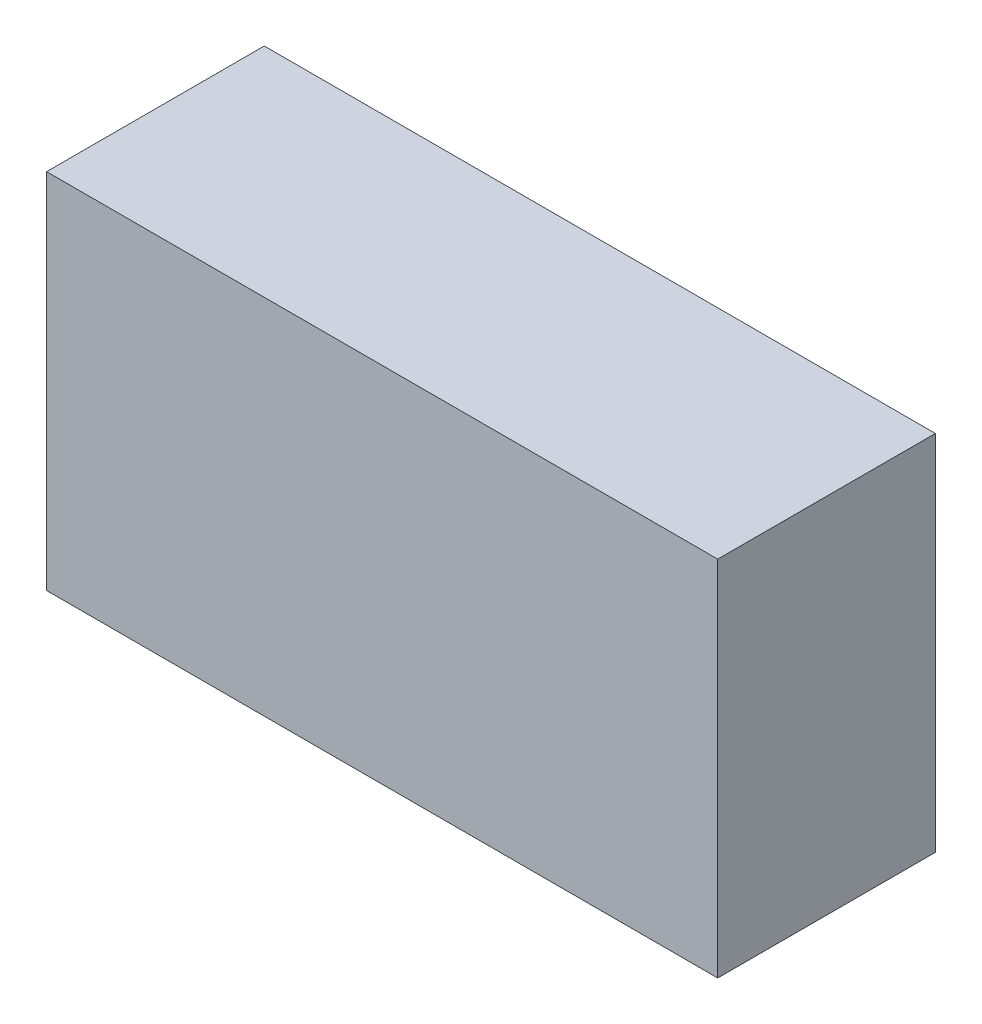
ISO-10303-21;
HEADER;
FILE_DESCRIPTION(('STEP AP214'),'2;1');
FILE_NAME('part.step','',(''),(''),'','','');
FILE_SCHEMA(('AUTOMOTIVE_DESIGN { 1 0 10303 214 1 1 1 1 }'));
ENDSEC;
DATA;
#1=APPLICATION_CONTEXT('core data for automotive mechanical design processes');
#2=APPLICATION_PROTOCOL_DEFINITION('international standard','automotive_design',2000,#1);
#3=PRODUCT_CONTEXT('',#1,'mechanical');
#4=PRODUCT('Part','Part','',(#3));
#5=PRODUCT_RELATED_PRODUCT_CATEGORY('part','',(#4));
#6=PRODUCT_DEFINITION_FORMATION('','',#4);
#7=PRODUCT_DEFINITION_CONTEXT('part definition',#1,'design');
#8=PRODUCT_DEFINITION('design','',#6,#7);
#9=PRODUCT_DEFINITION_SHAPE('','',#8);
#10=(LENGTH_UNIT() NAMED_UNIT(*) SI_UNIT(.MILLI.,.METRE.));
#11=(NAMED_UNIT(*) PLANE_ANGLE_UNIT() SI_UNIT($,.RADIAN.));
#12=(NAMED_UNIT(*) SI_UNIT($,.STERADIAN.) SOLID_ANGLE_UNIT());
#13=UNCERTAINTY_MEASURE_WITH_UNIT(LENGTH_MEASURE(1.E-05),#10,'distance_accuracy_value','');
#14=(GEOMETRIC_REPRESENTATION_CONTEXT(3) GLOBAL_UNCERTAINTY_ASSIGNED_CONTEXT((#13)) GLOBAL_UNIT_ASSIGNED_CONTEXT((#10,
#11,#12)) REPRESENTATION_CONTEXT('',''));
#15=CARTESIAN_POINT('',(0.,0.,0.));
#16=DIRECTION('',(0.,0.,1.));
#17=DIRECTION('',(1.,0.,0.));
#18=AXIS2_PLACEMENT_3D('',#15,#16,#17);
#19=CARTESIAN_POINT('',(0.,0.,12.));
#20=DIRECTION('',(1.,0.,0.));
#21=DIRECTION('',(0.,0.,-1.));
#22=AXIS2_PLACEMENT_3D('',#19,#20,#21);
#23=PLANE('',#22);
#24=DIRECTION('',(0.,-1.,0.));
#25=VECTOR('',#24,1.);
#26=CARTESIAN_POINT('',(0.,0.,0.));
#27=LINE('',#26,#25);
#28=CARTESIAN_POINT('',(0.,20.,0.));
#29=VERTEX_POINT('',#28);
#30=CARTESIAN_POINT('',(0.,0.,0.));
#31=VERTEX_POINT('',#30);
#32=EDGE_CURVE('E95',#29,#31,#27,.T.);
#33=ORIENTED_EDGE('',*,*,#32,.T.);
#34=DIRECTION('',(0.,0.,-1.));
#35=VECTOR('',#34,1.);
#36=CARTESIAN_POINT('',(0.,0.,12.));
#37=LINE('',#36,#35);
#38=CARTESIAN_POINT('',(0.,0.,12.));
#39=VERTEX_POINT('',#38);
#40=EDGE_CURVE('E11',#39,#31,#37,.T.);
#41=ORIENTED_EDGE('',*,*,#40,.F.);
#42=DIRECTION('',(0.,-1.,0.));
#43=VECTOR('',#42,1.);
#44=CARTESIAN_POINT('',(0.,0.,12.));
#45=LINE('',#44,#43);
#46=CARTESIAN_POINT('',(0.,20.,12.));
#47=VERTEX_POINT('',#46);
#48=EDGE_CURVE('E83',#47,#39,#45,.T.);
#49=ORIENTED_EDGE('',*,*,#48,.F.);
#50=DIRECTION('',(0.,0.,-1.));
#51=VECTOR('',#50,1.);
#52=CARTESIAN_POINT('',(0.,20.,12.));
#53=LINE('',#52,#51);
#54=EDGE_CURVE('E91',#47,#29,#53,.T.);
#55=ORIENTED_EDGE('',*,*,#54,.T.);
#56=EDGE_LOOP('',(#33,#41,#49,#55));
#57=FACE_BOUND('',#56,.T.);
#58=ADVANCED_FACE('F32',(#57),#23,.F.);
#59=CARTESIAN_POINT('',(0.,0.,12.));
#60=DIRECTION('',(0.,1.,0.));
#61=DIRECTION('',(0.,0.,1.));
#62=AXIS2_PLACEMENT_3D('',#59,#60,#61);
#63=PLANE('',#62);
#64=DIRECTION('',(1.,0.,0.));
#65=VECTOR('',#64,1.);
#66=CARTESIAN_POINT('',(0.,0.,0.));
#67=LINE('',#66,#65);
#68=CARTESIAN_POINT('',(37.,0.,0.));
#69=VERTEX_POINT('',#68);
#70=EDGE_CURVE('E87',#31,#69,#67,.T.);
#71=ORIENTED_EDGE('',*,*,#70,.T.);
#72=DIRECTION('',(0.,0.,-1.));
#73=VECTOR('',#72,1.);
#74=CARTESIAN_POINT('',(37.,0.,12.));
#75=LINE('',#74,#73);
#76=CARTESIAN_POINT('',(37.,0.,12.));
#77=VERTEX_POINT('',#76);
#78=EDGE_CURVE('E40',#77,#69,#75,.T.);
#79=ORIENTED_EDGE('',*,*,#78,.F.);
#80=DIRECTION('',(1.,0.,0.));
#81=VECTOR('',#80,1.);
#82=CARTESIAN_POINT('',(0.,0.,12.));
#83=LINE('',#82,#81);
#84=EDGE_CURVE('E78',#39,#77,#83,.T.);
#85=ORIENTED_EDGE('',*,*,#84,.F.);
#86=ORIENTED_EDGE('',*,*,#40,.T.);
#87=EDGE_LOOP('',(#71,#79,#85,#86));
#88=FACE_BOUND('',#87,.T.);
#89=ADVANCED_FACE('F86',(#88),#63,.F.);
#90=CARTESIAN_POINT('',(37.,0.,12.));
#91=DIRECTION('',(-1.,0.,0.));
#92=DIRECTION('',(0.,0.,1.));
#93=AXIS2_PLACEMENT_3D('',#90,#91,#92);
#94=PLANE('',#93);
#95=DIRECTION('',(0.,1.,0.));
#96=VECTOR('',#95,1.);
#97=CARTESIAN_POINT('',(37.,0.,0.));
#98=LINE('',#97,#96);
#99=CARTESIAN_POINT('',(37.,20.,0.));
#100=VERTEX_POINT('',#99);
#101=EDGE_CURVE('E65',#69,#100,#98,.T.);
#102=ORIENTED_EDGE('',*,*,#101,.T.);
#103=DIRECTION('',(0.,0.,-1.));
#104=VECTOR('',#103,1.);
#105=CARTESIAN_POINT('',(37.,20.,12.));
#106=LINE('',#105,#104);
#107=CARTESIAN_POINT('',(37.,20.,12.));
#108=VERTEX_POINT('',#107);
#109=EDGE_CURVE('E88',#108,#100,#106,.T.);
#110=ORIENTED_EDGE('',*,*,#109,.F.);
#111=DIRECTION('',(0.,1.,0.));
#112=VECTOR('',#111,1.);
#113=CARTESIAN_POINT('',(37.,0.,12.));
#114=LINE('',#113,#112);
#115=EDGE_CURVE('E81',#77,#108,#114,.T.);
#116=ORIENTED_EDGE('',*,*,#115,.F.);
#117=ORIENTED_EDGE('',*,*,#78,.T.);
#118=EDGE_LOOP('',(#102,#110,#116,#117));
#119=FACE_BOUND('',#118,.T.);
#120=ADVANCED_FACE('F89',(#119),#94,.F.);
#121=CARTESIAN_POINT('',(0.,20.,12.));
#122=DIRECTION('',(0.,-1.,0.));
#123=DIRECTION('',(0.,0.,-1.));
#124=AXIS2_PLACEMENT_3D('',#121,#122,#123);
#125=PLANE('',#124);
#126=DIRECTION('',(-1.,0.,0.));
#127=VECTOR('',#126,1.);
#128=CARTESIAN_POINT('',(0.,20.,0.));
#129=LINE('',#128,#127);
#130=EDGE_CURVE('E71',#100,#29,#129,.T.);
#131=ORIENTED_EDGE('',*,*,#130,.T.);
#132=ORIENTED_EDGE('',*,*,#54,.F.);
#133=DIRECTION('',(-1.,0.,0.));
#134=VECTOR('',#133,1.);
#135=CARTESIAN_POINT('',(0.,20.,12.));
#136=LINE('',#135,#134);
#137=EDGE_CURVE('E48',#108,#47,#136,.T.);
#138=ORIENTED_EDGE('',*,*,#137,.F.);
#139=ORIENTED_EDGE('',*,*,#109,.T.);
#140=EDGE_LOOP('',(#131,#132,#138,#139));
#141=FACE_BOUND('',#140,.T.);
#142=ADVANCED_FACE('F102',(#141),#125,.F.);
#143=CARTESIAN_POINT('',(0.,0.,12.));
#144=DIRECTION('',(0.,0.,-1.));
#145=DIRECTION('',(-1.,0.,0.));
#146=AXIS2_PLACEMENT_3D('',#143,#144,#145);
#147=PLANE('',#146);
#148=ORIENTED_EDGE('',*,*,#48,.T.);
#149=ORIENTED_EDGE('',*,*,#84,.T.);
#150=ORIENTED_EDGE('',*,*,#115,.T.);
#151=ORIENTED_EDGE('',*,*,#137,.T.);
#152=EDGE_LOOP('',(#148,#149,#150,#151));
#153=FACE_BOUND('',#152,.T.);
#154=ADVANCED_FACE('F79',(#153),#147,.F.);
#155=CARTESIAN_POINT('',(0.,0.,0.));
#156=DIRECTION('',(0.,0.,-1.));
#157=DIRECTION('',(-1.,0.,0.));
#158=AXIS2_PLACEMENT_3D('',#155,#156,#157);
#159=PLANE('',#158);
#160=ORIENTED_EDGE('',*,*,#32,.F.);
#161=ORIENTED_EDGE('',*,*,#130,.F.);
#162=ORIENTED_EDGE('',*,*,#101,.F.);
#163=ORIENTED_EDGE('',*,*,#70,.F.);
#164=EDGE_LOOP('',(#160,#161,#162,#163));
#165=FACE_BOUND('',#164,.T.);
#166=ADVANCED_FACE('F105',(#165),#159,.T.);
#167=CLOSED_SHELL('',(#58,#89,#120,#142,#154,#166));
#168=MANIFOLD_SOLID_BREP('B2',#167);
#169=ADVANCED_BREP_SHAPE_REPRESENTATION('',(#18,#168),#14);
#170=SHAPE_DEFINITION_REPRESENTATION(#9,#169);
ENDSEC;
END-ISO-10303-21;
